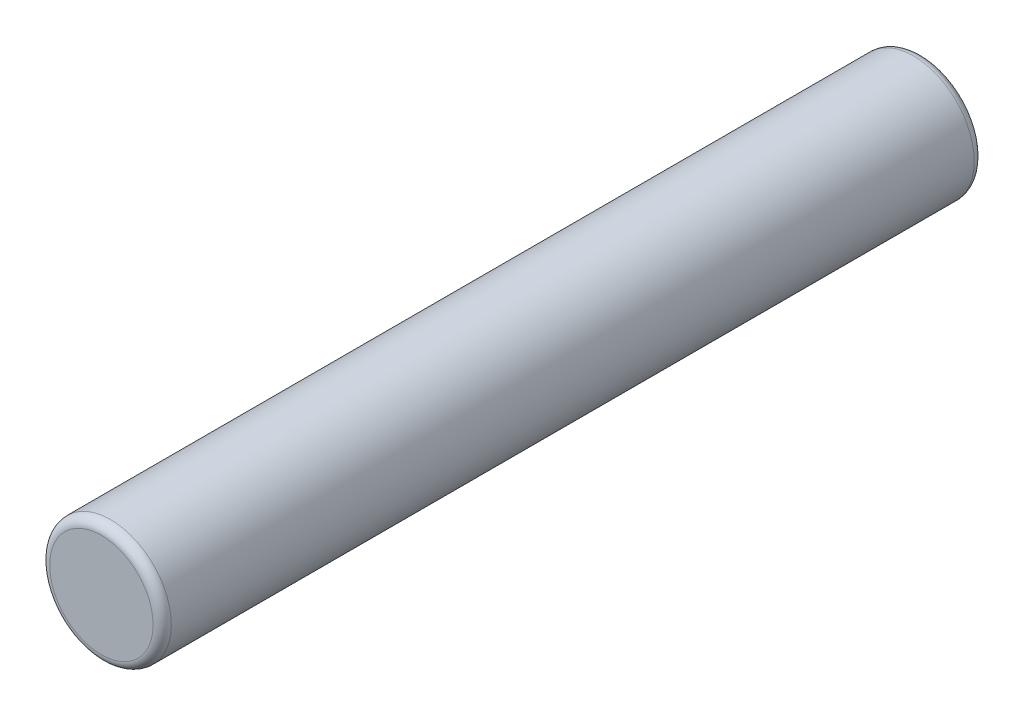
ISO-10303-21;
HEADER;
FILE_DESCRIPTION(('STEP AP214'),'2;1');
FILE_NAME('part.step','',(''),(''),'','','');
FILE_SCHEMA(('AUTOMOTIVE_DESIGN { 1 0 10303 214 1 1 1 1 }'));
ENDSEC;
DATA;
#1=APPLICATION_CONTEXT('core data for automotive mechanical design processes');
#2=APPLICATION_PROTOCOL_DEFINITION('international standard','automotive_design',2000,#1);
#3=PRODUCT_CONTEXT('',#1,'mechanical');
#4=PRODUCT('Part','Part','',(#3));
#5=PRODUCT_RELATED_PRODUCT_CATEGORY('part','',(#4));
#6=PRODUCT_DEFINITION_FORMATION('','',#4);
#7=PRODUCT_DEFINITION_CONTEXT('part definition',#1,'design');
#8=PRODUCT_DEFINITION('design','',#6,#7);
#9=PRODUCT_DEFINITION_SHAPE('','',#8);
#10=(LENGTH_UNIT() NAMED_UNIT(*) SI_UNIT(.MILLI.,.METRE.));
#11=(NAMED_UNIT(*) PLANE_ANGLE_UNIT() SI_UNIT($,.RADIAN.));
#12=(NAMED_UNIT(*) SI_UNIT($,.STERADIAN.) SOLID_ANGLE_UNIT());
#13=UNCERTAINTY_MEASURE_WITH_UNIT(LENGTH_MEASURE(1.E-05),#10,'distance_accuracy_value','');
#14=(GEOMETRIC_REPRESENTATION_CONTEXT(3) GLOBAL_UNCERTAINTY_ASSIGNED_CONTEXT((#13)) GLOBAL_UNIT_ASSIGNED_CONTEXT((#10,
#11,#12)) REPRESENTATION_CONTEXT('',''));
#15=CARTESIAN_POINT('',(0.,0.,0.));
#16=DIRECTION('',(0.,0.,1.));
#17=DIRECTION('',(1.,0.,0.));
#18=AXIS2_PLACEMENT_3D('',#15,#16,#17);
#19=CARTESIAN_POINT('',(0.,0.,135.));
#20=DIRECTION('',(0.,0.,-1.));
#21=DIRECTION('',(-1.,0.,0.));
#22=AXIS2_PLACEMENT_3D('',#19,#20,#21);
#23=CYLINDRICAL_SURFACE('',#22,20.);
#24=CARTESIAN_POINT('',(0.,0.,-132.));
#25=DIRECTION('',(0.,0.,1.));
#26=DIRECTION('',(1.,0.,0.));
#27=AXIS2_PLACEMENT_3D('',#24,#25,#26);
#28=CIRCLE('',#27,20.);
#29=CARTESIAN_POINT('',(20.,0.,-132.));
#30=VERTEX_POINT('',#29);
#31=EDGE_CURVE('E42',#30,#30,#28,.T.);
#32=ORIENTED_EDGE('',*,*,#31,.T.);
#33=EDGE_LOOP('',(#32));
#34=FACE_BOUND('',#33,.T.);
#35=CARTESIAN_POINT('',(0.,0.,132.));
#36=DIRECTION('',(0.,0.,1.));
#37=DIRECTION('',(1.,0.,0.));
#38=AXIS2_PLACEMENT_3D('',#35,#36,#37);
#39=CIRCLE('',#38,20.);
#40=CARTESIAN_POINT('',(20.,0.,132.));
#41=VERTEX_POINT('',#40);
#42=EDGE_CURVE('E46',#41,#41,#39,.F.);
#43=ORIENTED_EDGE('',*,*,#42,.T.);
#44=EDGE_LOOP('',(#43));
#45=FACE_BOUND('',#44,.T.);
#46=ADVANCED_FACE('F31',(#34,#45),#23,.T.);
#47=CARTESIAN_POINT('',(0.,0.,135.));
#48=DIRECTION('',(0.,0.,1.));
#49=DIRECTION('',(1.,0.,0.));
#50=AXIS2_PLACEMENT_3D('',#47,#48,#49);
#51=PLANE('',#50);
#52=CARTESIAN_POINT('',(0.,0.,135.));
#53=DIRECTION('',(0.,0.,1.));
#54=DIRECTION('',(1.,0.,0.));
#55=AXIS2_PLACEMENT_3D('',#52,#53,#54);
#56=CIRCLE('',#55,17.);
#57=CARTESIAN_POINT('',(17.,0.,135.));
#58=VERTEX_POINT('',#57);
#59=EDGE_CURVE('E10',#58,#58,#56,.T.);
#60=ORIENTED_EDGE('',*,*,#59,.T.);
#61=EDGE_LOOP('',(#60));
#62=FACE_BOUND('',#61,.T.);
#63=ADVANCED_FACE('F62',(#62),#51,.T.);
#64=CARTESIAN_POINT('',(0.,0.,-135.));
#65=DIRECTION('',(0.,0.,1.));
#66=DIRECTION('',(1.,0.,0.));
#67=AXIS2_PLACEMENT_3D('',#64,#65,#66);
#68=PLANE('',#67);
#69=CARTESIAN_POINT('',(0.,0.,-135.));
#70=DIRECTION('',(0.,0.,1.));
#71=DIRECTION('',(1.,0.,0.));
#72=AXIS2_PLACEMENT_3D('',#69,#70,#71);
#73=CIRCLE('',#72,17.);
#74=CARTESIAN_POINT('',(17.,0.,-135.));
#75=VERTEX_POINT('',#74);
#76=EDGE_CURVE('E38',#75,#75,#73,.F.);
#77=ORIENTED_EDGE('',*,*,#76,.T.);
#78=EDGE_LOOP('',(#77));
#79=FACE_BOUND('',#78,.T.);
#80=ADVANCED_FACE('F59',(#79),#68,.F.);
#81=CARTESIAN_POINT('',(0.,0.,-132.));
#82=DIRECTION('',(0.,0.,1.));
#83=DIRECTION('',(1.,0.,0.));
#84=AXIS2_PLACEMENT_3D('',#81,#82,#83);
#85=TOROIDAL_SURFACE('',#84,17.,3.);
#86=ORIENTED_EDGE('',*,*,#76,.F.);
#87=EDGE_LOOP('',(#86));
#88=FACE_BOUND('',#87,.T.);
#89=ORIENTED_EDGE('',*,*,#31,.F.);
#90=EDGE_LOOP('',(#89));
#91=FACE_BOUND('',#90,.T.);
#92=ADVANCED_FACE('F55',(#88,#91),#85,.T.);
#93=CARTESIAN_POINT('',(0.,0.,132.));
#94=DIRECTION('',(0.,0.,1.));
#95=DIRECTION('',(1.,0.,0.));
#96=AXIS2_PLACEMENT_3D('',#93,#94,#95);
#97=TOROIDAL_SURFACE('',#96,17.,3.);
#98=ORIENTED_EDGE('',*,*,#42,.F.);
#99=EDGE_LOOP('',(#98));
#100=FACE_BOUND('',#99,.T.);
#101=ORIENTED_EDGE('',*,*,#59,.F.);
#102=EDGE_LOOP('',(#101));
#103=FACE_BOUND('',#102,.T.);
#104=ADVANCED_FACE('F33',(#100,#103),#97,.T.);
#105=CLOSED_SHELL('',(#46,#63,#80,#92,#104));
#106=MANIFOLD_SOLID_BREP('B2',#105);
#107=ADVANCED_BREP_SHAPE_REPRESENTATION('',(#18,#106),#14);
#108=SHAPE_DEFINITION_REPRESENTATION(#9,#107);
ENDSEC;
END-ISO-10303-21;
